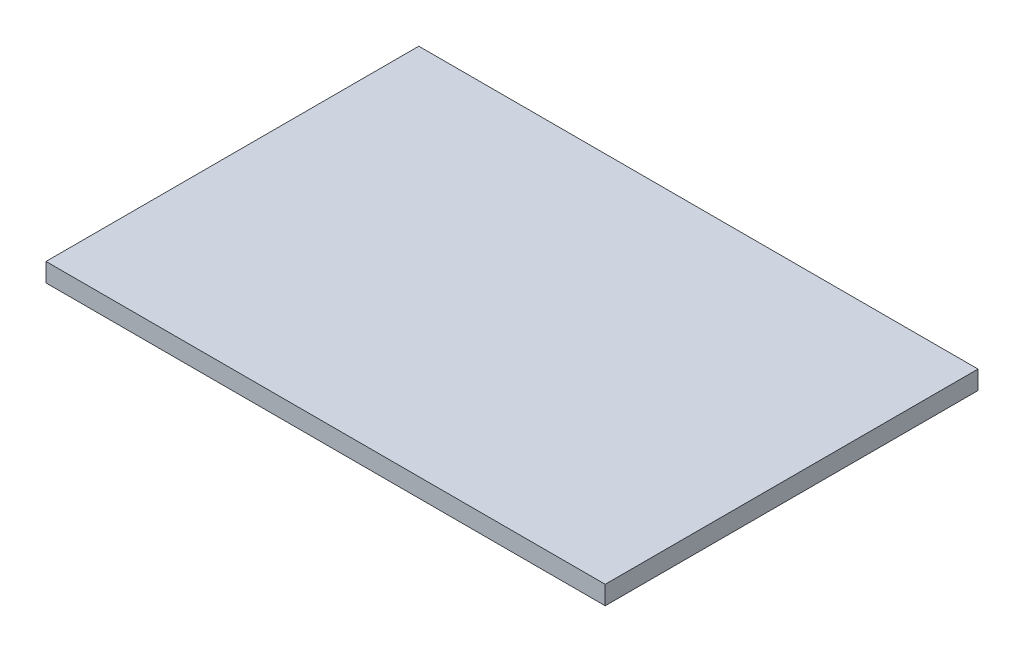
ISO-10303-21;
HEADER;
FILE_DESCRIPTION(('STEP AP214'),'2;1');
FILE_NAME('part.step','',(''),(''),'','','');
FILE_SCHEMA(('AUTOMOTIVE_DESIGN { 1 0 10303 214 1 1 1 1 }'));
ENDSEC;
DATA;
#1=APPLICATION_CONTEXT('core data for automotive mechanical design processes');
#2=APPLICATION_PROTOCOL_DEFINITION('international standard','automotive_design',2000,#1);
#3=PRODUCT_CONTEXT('',#1,'mechanical');
#4=PRODUCT('Part','Part','',(#3));
#5=PRODUCT_RELATED_PRODUCT_CATEGORY('part','',(#4));
#6=PRODUCT_DEFINITION_FORMATION('','',#4);
#7=PRODUCT_DEFINITION_CONTEXT('part definition',#1,'design');
#8=PRODUCT_DEFINITION('design','',#6,#7);
#9=PRODUCT_DEFINITION_SHAPE('','',#8);
#10=(LENGTH_UNIT() NAMED_UNIT(*) SI_UNIT(.MILLI.,.METRE.));
#11=(NAMED_UNIT(*) PLANE_ANGLE_UNIT() SI_UNIT($,.RADIAN.));
#12=(NAMED_UNIT(*) SI_UNIT($,.STERADIAN.) SOLID_ANGLE_UNIT());
#13=UNCERTAINTY_MEASURE_WITH_UNIT(LENGTH_MEASURE(1.E-05),#10,'distance_accuracy_value','');
#14=(GEOMETRIC_REPRESENTATION_CONTEXT(3) GLOBAL_UNCERTAINTY_ASSIGNED_CONTEXT((#13)) GLOBAL_UNIT_ASSIGNED_CONTEXT((#10,
#11,#12)) REPRESENTATION_CONTEXT('',''));
#15=CARTESIAN_POINT('',(0.,0.,0.));
#16=DIRECTION('',(0.,0.,1.));
#17=DIRECTION('',(1.,0.,0.));
#18=AXIS2_PLACEMENT_3D('',#15,#16,#17);
#19=CARTESIAN_POINT('',(-29.3183421078722,2.54,4.75781485876417));
#20=DIRECTION('',(1.,0.,0.));
#21=DIRECTION('',(0.,0.,-1.));
#22=AXIS2_PLACEMENT_3D('',#19,#20,#21);
#23=PLANE('',#22);
#24=DIRECTION('',(0.,0.,1.));
#25=VECTOR('',#24,1.);
#26=CARTESIAN_POINT('',(-29.3183421078722,0.,4.75781485876417));
#27=LINE('',#26,#25);
#28=CARTESIAN_POINT('',(-29.3183421078722,0.,-46.0421851412358));
#29=VERTEX_POINT('',#28);
#30=CARTESIAN_POINT('',(-29.3183421078722,0.,4.75781485876417));
#31=VERTEX_POINT('',#30);
#32=EDGE_CURVE('E94',#29,#31,#27,.T.);
#33=ORIENTED_EDGE('',*,*,#32,.T.);
#34=DIRECTION('',(0.,-1.,0.));
#35=VECTOR('',#34,1.);
#36=CARTESIAN_POINT('',(-29.3183421078722,2.54,4.75781485876417));
#37=LINE('',#36,#35);
#38=CARTESIAN_POINT('',(-29.3183421078722,2.54,4.75781485876417));
#39=VERTEX_POINT('',#38);
#40=EDGE_CURVE('E11',#39,#31,#37,.T.);
#41=ORIENTED_EDGE('',*,*,#40,.F.);
#42=DIRECTION('',(0.,0.,1.));
#43=VECTOR('',#42,1.);
#44=CARTESIAN_POINT('',(-29.3183421078722,2.54,4.75781485876417));
#45=LINE('',#44,#43);
#46=CARTESIAN_POINT('',(-29.3183421078722,2.54,-46.0421851412358));
#47=VERTEX_POINT('',#46);
#48=EDGE_CURVE('E82',#47,#39,#45,.T.);
#49=ORIENTED_EDGE('',*,*,#48,.F.);
#50=DIRECTION('',(0.,-1.,0.));
#51=VECTOR('',#50,1.);
#52=CARTESIAN_POINT('',(-29.3183421078722,2.54,-46.0421851412358));
#53=LINE('',#52,#51);
#54=EDGE_CURVE('E90',#47,#29,#53,.T.);
#55=ORIENTED_EDGE('',*,*,#54,.T.);
#56=EDGE_LOOP('',(#33,#41,#49,#55));
#57=FACE_BOUND('',#56,.T.);
#58=ADVANCED_FACE('F31',(#57),#23,.F.);
#59=CARTESIAN_POINT('',(-29.3183421078722,2.54,4.75781485876417));
#60=DIRECTION('',(0.,0.,-1.));
#61=DIRECTION('',(-1.,0.,0.));
#62=AXIS2_PLACEMENT_3D('',#59,#60,#61);
#63=PLANE('',#62);
#64=DIRECTION('',(1.,0.,0.));
#65=VECTOR('',#64,1.);
#66=CARTESIAN_POINT('',(-29.3183421078722,0.,4.75781485876417));
#67=LINE('',#66,#65);
#68=CARTESIAN_POINT('',(46.8816578921278,0.,4.75781485876417));
#69=VERTEX_POINT('',#68);
#70=EDGE_CURVE('E86',#31,#69,#67,.T.);
#71=ORIENTED_EDGE('',*,*,#70,.T.);
#72=DIRECTION('',(0.,-1.,0.));
#73=VECTOR('',#72,1.);
#74=CARTESIAN_POINT('',(46.8816578921278,2.54,4.75781485876417));
#75=LINE('',#74,#73);
#76=CARTESIAN_POINT('',(46.8816578921278,2.54,4.75781485876417));
#77=VERTEX_POINT('',#76);
#78=EDGE_CURVE('E39',#77,#69,#75,.T.);
#79=ORIENTED_EDGE('',*,*,#78,.F.);
#80=DIRECTION('',(1.,0.,0.));
#81=VECTOR('',#80,1.);
#82=CARTESIAN_POINT('',(-29.3183421078722,2.54,4.75781485876417));
#83=LINE('',#82,#81);
#84=EDGE_CURVE('E77',#39,#77,#83,.T.);
#85=ORIENTED_EDGE('',*,*,#84,.F.);
#86=ORIENTED_EDGE('',*,*,#40,.T.);
#87=EDGE_LOOP('',(#71,#79,#85,#86));
#88=FACE_BOUND('',#87,.T.);
#89=ADVANCED_FACE('F85',(#88),#63,.F.);
#90=CARTESIAN_POINT('',(46.8816578921278,2.54,4.75781485876417));
#91=DIRECTION('',(-1.,0.,0.));
#92=DIRECTION('',(0.,0.,1.));
#93=AXIS2_PLACEMENT_3D('',#90,#91,#92);
#94=PLANE('',#93);
#95=DIRECTION('',(0.,0.,-1.));
#96=VECTOR('',#95,1.);
#97=CARTESIAN_POINT('',(46.8816578921278,0.,4.75781485876417));
#98=LINE('',#97,#96);
#99=CARTESIAN_POINT('',(46.8816578921278,0.,-46.0421851412358));
#100=VERTEX_POINT('',#99);
#101=EDGE_CURVE('E64',#69,#100,#98,.T.);
#102=ORIENTED_EDGE('',*,*,#101,.T.);
#103=DIRECTION('',(0.,-1.,0.));
#104=VECTOR('',#103,1.);
#105=CARTESIAN_POINT('',(46.8816578921278,2.54,-46.0421851412358));
#106=LINE('',#105,#104);
#107=CARTESIAN_POINT('',(46.8816578921278,2.54,-46.0421851412358));
#108=VERTEX_POINT('',#107);
#109=EDGE_CURVE('E87',#108,#100,#106,.T.);
#110=ORIENTED_EDGE('',*,*,#109,.F.);
#111=DIRECTION('',(0.,0.,-1.));
#112=VECTOR('',#111,1.);
#113=CARTESIAN_POINT('',(46.8816578921278,2.54,4.75781485876417));
#114=LINE('',#113,#112);
#115=EDGE_CURVE('E80',#77,#108,#114,.T.);
#116=ORIENTED_EDGE('',*,*,#115,.F.);
#117=ORIENTED_EDGE('',*,*,#78,.T.);
#118=EDGE_LOOP('',(#102,#110,#116,#117));
#119=FACE_BOUND('',#118,.T.);
#120=ADVANCED_FACE('F88',(#119),#94,.F.);
#121=CARTESIAN_POINT('',(-29.3183421078722,2.54,-46.0421851412358));
#122=DIRECTION('',(0.,0.,1.));
#123=DIRECTION('',(1.,0.,0.));
#124=AXIS2_PLACEMENT_3D('',#121,#122,#123);
#125=PLANE('',#124);
#126=DIRECTION('',(-1.,0.,0.));
#127=VECTOR('',#126,1.);
#128=CARTESIAN_POINT('',(-29.3183421078722,0.,-46.0421851412358));
#129=LINE('',#128,#127);
#130=EDGE_CURVE('E70',#100,#29,#129,.T.);
#131=ORIENTED_EDGE('',*,*,#130,.T.);
#132=ORIENTED_EDGE('',*,*,#54,.F.);
#133=DIRECTION('',(-1.,0.,0.));
#134=VECTOR('',#133,1.);
#135=CARTESIAN_POINT('',(-29.3183421078722,2.54,-46.0421851412358));
#136=LINE('',#135,#134);
#137=EDGE_CURVE('E47',#108,#47,#136,.T.);
#138=ORIENTED_EDGE('',*,*,#137,.F.);
#139=ORIENTED_EDGE('',*,*,#109,.T.);
#140=EDGE_LOOP('',(#131,#132,#138,#139));
#141=FACE_BOUND('',#140,.T.);
#142=ADVANCED_FACE('F101',(#141),#125,.F.);
#143=CARTESIAN_POINT('',(-29.3183421078722,2.54,-46.0421851412358));
#144=DIRECTION('',(0.,-1.,0.));
#145=DIRECTION('',(0.,0.,-1.));
#146=AXIS2_PLACEMENT_3D('',#143,#144,#145);
#147=PLANE('',#146);
#148=ORIENTED_EDGE('',*,*,#48,.T.);
#149=ORIENTED_EDGE('',*,*,#84,.T.);
#150=ORIENTED_EDGE('',*,*,#115,.T.);
#151=ORIENTED_EDGE('',*,*,#137,.T.);
#152=EDGE_LOOP('',(#148,#149,#150,#151));
#153=FACE_BOUND('',#152,.T.);
#154=ADVANCED_FACE('F78',(#153),#147,.F.);
#155=CARTESIAN_POINT('',(-29.3183421078722,0.,-46.0421851412358));
#156=DIRECTION('',(0.,-1.,0.));
#157=DIRECTION('',(0.,0.,-1.));
#158=AXIS2_PLACEMENT_3D('',#155,#156,#157);
#159=PLANE('',#158);
#160=ORIENTED_EDGE('',*,*,#32,.F.);
#161=ORIENTED_EDGE('',*,*,#130,.F.);
#162=ORIENTED_EDGE('',*,*,#101,.F.);
#163=ORIENTED_EDGE('',*,*,#70,.F.);
#164=EDGE_LOOP('',(#160,#161,#162,#163));
#165=FACE_BOUND('',#164,.T.);
#166=ADVANCED_FACE('F104',(#165),#159,.T.);
#167=CLOSED_SHELL('',(#58,#89,#120,#142,#154,#166));
#168=MANIFOLD_SOLID_BREP('B2',#167);
#169=ADVANCED_BREP_SHAPE_REPRESENTATION('',(#18,#168),#14);
#170=SHAPE_DEFINITION_REPRESENTATION(#9,#169);
ENDSEC;
END-ISO-10303-21;
